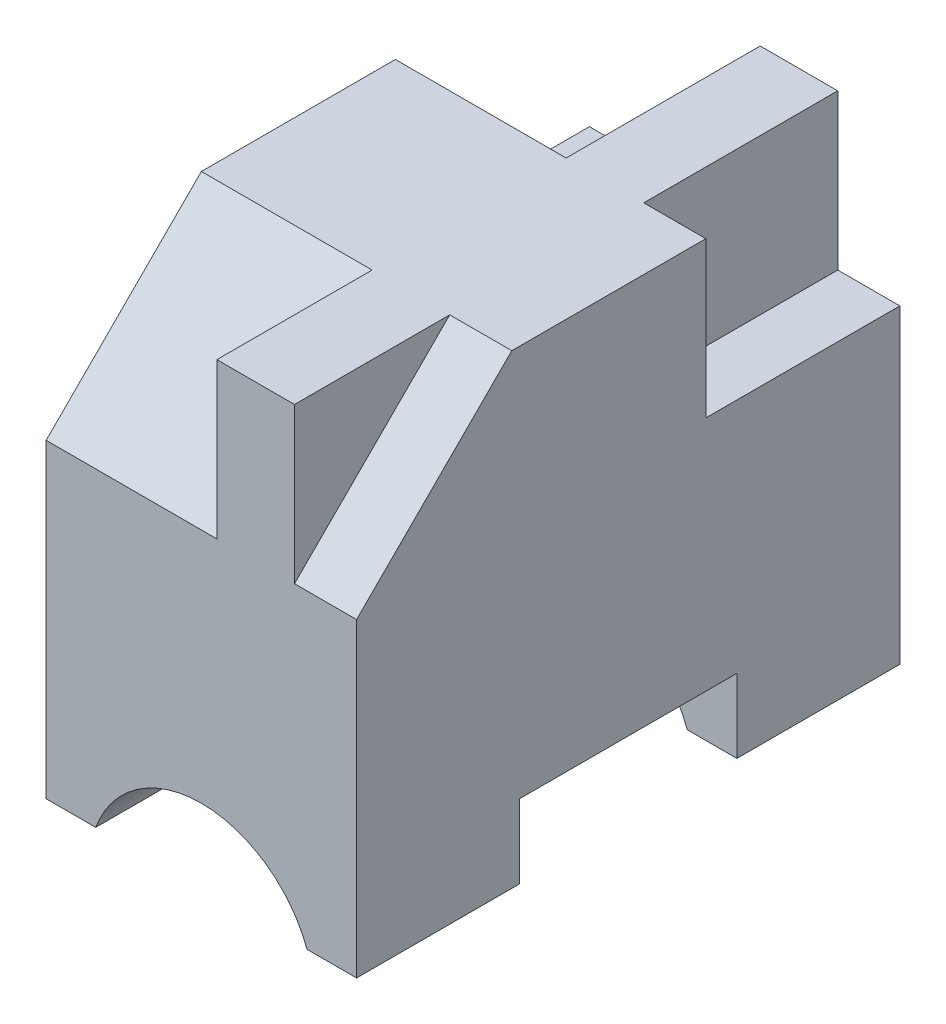
ISO-10303-21;
HEADER;
FILE_DESCRIPTION(('STEP AP214'),'2;1');
FILE_NAME('part.step','',(''),(''),'','','');
FILE_SCHEMA(('AUTOMOTIVE_DESIGN { 1 0 10303 214 1 1 1 1 }'));
ENDSEC;
DATA;
#1=APPLICATION_CONTEXT('core data for automotive mechanical design processes');
#2=APPLICATION_PROTOCOL_DEFINITION('international standard','automotive_design',2000,#1);
#3=PRODUCT_CONTEXT('',#1,'mechanical');
#4=PRODUCT('Part','Part','',(#3));
#5=PRODUCT_RELATED_PRODUCT_CATEGORY('part','',(#4));
#6=PRODUCT_DEFINITION_FORMATION('','',#4);
#7=PRODUCT_DEFINITION_CONTEXT('part definition',#1,'design');
#8=PRODUCT_DEFINITION('design','',#6,#7);
#9=PRODUCT_DEFINITION_SHAPE('','',#8);
#10=(LENGTH_UNIT() NAMED_UNIT(*) SI_UNIT(.MILLI.,.METRE.));
#11=(NAMED_UNIT(*) PLANE_ANGLE_UNIT() SI_UNIT($,.RADIAN.));
#12=(NAMED_UNIT(*) SI_UNIT($,.STERADIAN.) SOLID_ANGLE_UNIT());
#13=UNCERTAINTY_MEASURE_WITH_UNIT(LENGTH_MEASURE(1.E-05),#10,'distance_accuracy_value','');
#14=(GEOMETRIC_REPRESENTATION_CONTEXT(3) GLOBAL_UNCERTAINTY_ASSIGNED_CONTEXT((#13)) GLOBAL_UNIT_ASSIGNED_CONTEXT((#10,
#11,#12)) REPRESENTATION_CONTEXT('',''));
#15=CARTESIAN_POINT('',(0.,0.,0.));
#16=DIRECTION('',(0.,0.,1.));
#17=DIRECTION('',(1.,0.,0.));
#18=AXIS2_PLACEMENT_3D('',#15,#16,#17);
#19=CARTESIAN_POINT('',(0.,-35.,70.));
#20=DIRECTION('',(0.,0.,-1.));
#21=DIRECTION('',(-1.,0.,0.));
#22=AXIS2_PLACEMENT_3D('',#19,#20,#21);
#23=CYLINDRICAL_SURFACE('',#22,14.5);
#24=CARTESIAN_POINT('',(0.,-35.,21.));
#25=DIRECTION('',(0.,0.,-1.));
#26=DIRECTION('',(-1.,0.,0.));
#27=AXIS2_PLACEMENT_3D('',#24,#25,#26);
#28=CIRCLE('',#27,14.5);
#29=CARTESIAN_POINT('',(-13.6106575888162,-30.,21.));
#30=VERTEX_POINT('',#29);
#31=CARTESIAN_POINT('',(0.,-20.5,21.));
#32=VERTEX_POINT('',#31);
#33=EDGE_CURVE('E294',#30,#32,#28,.T.);
#34=ORIENTED_EDGE('',*,*,#33,.F.);
#35=DIRECTION('',(0.,0.,-1.));
#36=VECTOR('',#35,1.);
#37=CARTESIAN_POINT('',(-13.6106575888162,-30.,70.));
#38=LINE('',#37,#36);
#39=CARTESIAN_POINT('',(-13.6106575888162,-30.,0.));
#40=VERTEX_POINT('',#39);
#41=EDGE_CURVE('E250',#30,#40,#38,.T.);
#42=ORIENTED_EDGE('',*,*,#41,.T.);
#43=CARTESIAN_POINT('',(0.,-35.,0.));
#44=DIRECTION('',(0.,0.,1.));
#45=DIRECTION('',(1.,0.,0.));
#46=AXIS2_PLACEMENT_3D('',#43,#44,#45);
#47=CIRCLE('',#46,14.5);
#48=CARTESIAN_POINT('',(13.6106575888162,-30.,0.));
#49=VERTEX_POINT('',#48);
#50=EDGE_CURVE('E277',#49,#40,#47,.T.);
#51=ORIENTED_EDGE('',*,*,#50,.F.);
#52=DIRECTION('',(0.,0.,-1.));
#53=VECTOR('',#52,1.);
#54=CARTESIAN_POINT('',(13.6106575888162,-30.,70.));
#55=LINE('',#54,#53);
#56=CARTESIAN_POINT('',(13.6106575888162,-30.,21.));
#57=VERTEX_POINT('',#56);
#58=EDGE_CURVE('E240',#57,#49,#55,.T.);
#59=ORIENTED_EDGE('',*,*,#58,.F.);
#60=EDGE_CURVE('E295',#32,#57,#28,.T.);
#61=ORIENTED_EDGE('',*,*,#60,.F.);
#62=EDGE_LOOP('',(#34,#42,#51,#59,#61));
#63=FACE_BOUND('',#62,.T.);
#64=ADVANCED_FACE('F47',(#63),#23,.F.);
#65=CARTESIAN_POINT('',(0.,-30.,70.));
#66=DIRECTION('',(0.,1.,0.));
#67=DIRECTION('',(0.,0.,1.));
#68=AXIS2_PLACEMENT_3D('',#65,#66,#67);
#69=PLANE('',#68);
#70=CARTESIAN_POINT('',(13.6106575888162,-30.,70.));
#71=VERTEX_POINT('',#70);
#72=CARTESIAN_POINT('',(13.6106575888162,-30.,49.));
#73=VERTEX_POINT('',#72);
#74=EDGE_CURVE('E241',#71,#73,#55,.T.);
#75=ORIENTED_EDGE('',*,*,#74,.T.);
#76=DIRECTION('',(-1.,0.,0.));
#77=VECTOR('',#76,1.);
#78=CARTESIAN_POINT('',(20.,-30.,49.));
#79=LINE('',#78,#77);
#80=CARTESIAN_POINT('',(20.,-30.,49.));
#81=VERTEX_POINT('',#80);
#82=EDGE_CURVE('E297',#81,#73,#79,.T.);
#83=ORIENTED_EDGE('',*,*,#82,.F.);
#84=DIRECTION('',(0.,0.,-1.));
#85=VECTOR('',#84,1.);
#86=CARTESIAN_POINT('',(20.,-30.,70.));
#87=LINE('',#86,#85);
#88=CARTESIAN_POINT('',(20.,-30.,70.));
#89=VERTEX_POINT('',#88);
#90=EDGE_CURVE('E237',#89,#81,#87,.T.);
#91=ORIENTED_EDGE('',*,*,#90,.F.);
#92=DIRECTION('',(1.,0.,0.));
#93=VECTOR('',#92,1.);
#94=CARTESIAN_POINT('',(0.,-30.,70.));
#95=LINE('',#94,#93);
#96=EDGE_CURVE('E288',#71,#89,#95,.T.);
#97=ORIENTED_EDGE('',*,*,#96,.F.);
#98=EDGE_LOOP('',(#75,#83,#91,#97));
#99=FACE_BOUND('',#98,.T.);
#100=ADVANCED_FACE('F460',(#99),#69,.F.);
#101=DIRECTION('',(0.,0.,-1.));
#102=VECTOR('',#101,1.);
#103=CARTESIAN_POINT('',(-20.,-30.,70.));
#104=LINE('',#103,#102);
#105=CARTESIAN_POINT('',(-20.,-30.,70.));
#106=VERTEX_POINT('',#105);
#107=CARTESIAN_POINT('',(-20.,-30.,49.));
#108=VERTEX_POINT('',#107);
#109=EDGE_CURVE('E227',#106,#108,#104,.T.);
#110=ORIENTED_EDGE('',*,*,#109,.T.);
#111=DIRECTION('',(1.,0.,0.));
#112=VECTOR('',#111,1.);
#113=CARTESIAN_POINT('',(0.,-30.,49.));
#114=LINE('',#113,#112);
#115=CARTESIAN_POINT('',(-13.6106575888162,-30.,49.));
#116=VERTEX_POINT('',#115);
#117=EDGE_CURVE('E13',#108,#116,#114,.T.);
#118=ORIENTED_EDGE('',*,*,#117,.T.);
#119=CARTESIAN_POINT('',(-13.6106575888162,-30.,70.));
#120=VERTEX_POINT('',#119);
#121=EDGE_CURVE('E259',#120,#116,#38,.T.);
#122=ORIENTED_EDGE('',*,*,#121,.F.);
#123=EDGE_CURVE('E265',#106,#120,#95,.T.);
#124=ORIENTED_EDGE('',*,*,#123,.F.);
#125=EDGE_LOOP('',(#110,#118,#122,#124));
#126=FACE_BOUND('',#125,.T.);
#127=ADVANCED_FACE('F414',(#126),#69,.F.);
#128=CARTESIAN_POINT('',(0.,-35.,49.));
#129=DIRECTION('',(0.,0.,1.));
#130=DIRECTION('',(0.,-1.,0.));
#131=AXIS2_PLACEMENT_3D('',#128,#129,#130);
#132=CIRCLE('',#131,14.5);
#133=CARTESIAN_POINT('',(0.,-20.5,49.));
#134=VERTEX_POINT('',#133);
#135=EDGE_CURVE('E280',#73,#134,#132,.T.);
#136=ORIENTED_EDGE('',*,*,#135,.F.);
#137=ORIENTED_EDGE('',*,*,#74,.F.);
#138=CARTESIAN_POINT('',(0.,-35.,70.));
#139=DIRECTION('',(0.,0.,1.));
#140=DIRECTION('',(1.,0.,0.));
#141=AXIS2_PLACEMENT_3D('',#138,#139,#140);
#142=CIRCLE('',#141,14.5);
#143=EDGE_CURVE('E290',#71,#120,#142,.T.);
#144=ORIENTED_EDGE('',*,*,#143,.T.);
#145=ORIENTED_EDGE('',*,*,#121,.T.);
#146=EDGE_CURVE('E292',#134,#116,#132,.T.);
#147=ORIENTED_EDGE('',*,*,#146,.F.);
#148=EDGE_LOOP('',(#136,#137,#144,#145,#147));
#149=FACE_BOUND('',#148,.T.);
#150=ADVANCED_FACE('F49',(#149),#23,.F.);
#151=CARTESIAN_POINT('',(20.,-30.,21.));
#152=VERTEX_POINT('',#151);
#153=CARTESIAN_POINT('',(20.,-30.,0.));
#154=VERTEX_POINT('',#153);
#155=EDGE_CURVE('E230',#152,#154,#87,.T.);
#156=ORIENTED_EDGE('',*,*,#155,.F.);
#157=DIRECTION('',(-1.,0.,0.));
#158=VECTOR('',#157,1.);
#159=CARTESIAN_POINT('',(20.,-30.,21.));
#160=LINE('',#159,#158);
#161=EDGE_CURVE('E306',#152,#57,#160,.T.);
#162=ORIENTED_EDGE('',*,*,#161,.T.);
#163=ORIENTED_EDGE('',*,*,#58,.T.);
#164=DIRECTION('',(1.,0.,0.));
#165=VECTOR('',#164,1.);
#166=CARTESIAN_POINT('',(0.,-30.,0.));
#167=LINE('',#166,#165);
#168=EDGE_CURVE('E274',#49,#154,#167,.T.);
#169=ORIENTED_EDGE('',*,*,#168,.T.);
#170=EDGE_LOOP('',(#156,#162,#163,#169));
#171=FACE_BOUND('',#170,.T.);
#172=ADVANCED_FACE('F467',(#171),#69,.F.);
#173=CARTESIAN_POINT('',(20.,0.,70.));
#174=DIRECTION('',(-1.,0.,0.));
#175=DIRECTION('',(0.,0.,1.));
#176=AXIS2_PLACEMENT_3D('',#173,#174,#175);
#177=PLANE('',#176);
#178=DIRECTION('',(0.,1.,0.));
#179=VECTOR('',#178,1.);
#180=CARTESIAN_POINT('',(20.,0.,0.));
#181=LINE('',#180,#179);
#182=CARTESIAN_POINT('',(20.,10.,0.));
#183=VERTEX_POINT('',#182);
#184=EDGE_CURVE('E271',#154,#183,#181,.T.);
#185=ORIENTED_EDGE('',*,*,#184,.T.);
#186=DIRECTION('',(0.,0.,-1.));
#187=VECTOR('',#186,1.);
#188=CARTESIAN_POINT('',(20.,10.,0.));
#189=LINE('',#188,#187);
#190=CARTESIAN_POINT('',(20.,10.,25.));
#191=VERTEX_POINT('',#190);
#192=EDGE_CURVE('E349',#191,#183,#189,.T.);
#193=ORIENTED_EDGE('',*,*,#192,.F.);
#194=DIRECTION('',(0.,-1.,0.));
#195=VECTOR('',#194,1.);
#196=CARTESIAN_POINT('',(20.,30.,25.));
#197=LINE('',#196,#195);
#198=CARTESIAN_POINT('',(20.,30.,25.));
#199=VERTEX_POINT('',#198);
#200=EDGE_CURVE('E352',#199,#191,#197,.T.);
#201=ORIENTED_EDGE('',*,*,#200,.F.);
#202=DIRECTION('',(0.,0.,-1.));
#203=VECTOR('',#202,1.);
#204=CARTESIAN_POINT('',(20.,30.,70.));
#205=LINE('',#204,#203);
#206=CARTESIAN_POINT('',(20.,30.,50.));
#207=VERTEX_POINT('',#206);
#208=EDGE_CURVE('E226',#207,#199,#205,.T.);
#209=ORIENTED_EDGE('',*,*,#208,.F.);
#210=DIRECTION('',(0.,0.707106781186547,-0.707106781186548));
#211=VECTOR('',#210,1.);
#212=CARTESIAN_POINT('',(20.,10.,70.));
#213=LINE('',#212,#211);
#214=CARTESIAN_POINT('',(20.,10.,70.));
#215=VERTEX_POINT('',#214);
#216=EDGE_CURVE('E332',#215,#207,#213,.T.);
#217=ORIENTED_EDGE('',*,*,#216,.F.);
#218=DIRECTION('',(0.,1.,0.));
#219=VECTOR('',#218,1.);
#220=CARTESIAN_POINT('',(20.,0.,70.));
#221=LINE('',#220,#219);
#222=EDGE_CURVE('E285',#89,#215,#221,.T.);
#223=ORIENTED_EDGE('',*,*,#222,.F.);
#224=ORIENTED_EDGE('',*,*,#90,.T.);
#225=DIRECTION('',(0.,1.,0.));
#226=VECTOR('',#225,1.);
#227=CARTESIAN_POINT('',(20.,-30.,49.));
#228=LINE('',#227,#226);
#229=CARTESIAN_POINT('',(20.,-20.5,49.));
#230=VERTEX_POINT('',#229);
#231=EDGE_CURVE('E311',#81,#230,#228,.T.);
#232=ORIENTED_EDGE('',*,*,#231,.T.);
#233=DIRECTION('',(0.,0.,-1.));
#234=VECTOR('',#233,1.);
#235=CARTESIAN_POINT('',(20.,-20.5,21.));
#236=LINE('',#235,#234);
#237=CARTESIAN_POINT('',(20.,-20.5,21.));
#238=VERTEX_POINT('',#237);
#239=EDGE_CURVE('E322',#230,#238,#236,.T.);
#240=ORIENTED_EDGE('',*,*,#239,.T.);
#241=DIRECTION('',(0.,-1.,0.));
#242=VECTOR('',#241,1.);
#243=CARTESIAN_POINT('',(20.,-30.,21.));
#244=LINE('',#243,#242);
#245=EDGE_CURVE('E319',#238,#152,#244,.T.);
#246=ORIENTED_EDGE('',*,*,#245,.T.);
#247=ORIENTED_EDGE('',*,*,#155,.T.);
#248=EDGE_LOOP('',(#185,#193,#201,#209,#217,#223,#224,#232,#240,#246,#247));
#249=FACE_BOUND('',#248,.T.);
#250=ADVANCED_FACE('F406',(#249),#177,.F.);
#251=CARTESIAN_POINT('',(0.,30.,70.));
#252=DIRECTION('',(0.,1.,0.));
#253=DIRECTION('',(0.,0.,1.));
#254=AXIS2_PLACEMENT_3D('',#251,#252,#253);
#255=PLANE('',#254);
#256=DIRECTION('',(1.,0.,0.));
#257=VECTOR('',#256,1.);
#258=CARTESIAN_POINT('',(-20.,30.,25.));
#259=LINE('',#258,#257);
#260=CARTESIAN_POINT('',(-20.,30.,25.));
#261=VERTEX_POINT('',#260);
#262=CARTESIAN_POINT('',(1.99999999999999,30.,25.));
#263=VERTEX_POINT('',#262);
#264=EDGE_CURVE('E206',#261,#263,#259,.T.);
#265=ORIENTED_EDGE('',*,*,#264,.F.);
#266=DIRECTION('',(0.,0.,-1.));
#267=VECTOR('',#266,1.);
#268=CARTESIAN_POINT('',(-20.,30.,70.));
#269=LINE('',#268,#267);
#270=CARTESIAN_POINT('',(-20.,30.,50.));
#271=VERTEX_POINT('',#270);
#272=EDGE_CURVE('E219',#271,#261,#269,.T.);
#273=ORIENTED_EDGE('',*,*,#272,.F.);
#274=DIRECTION('',(1.,0.,0.));
#275=VECTOR('',#274,1.);
#276=CARTESIAN_POINT('',(-20.,30.,50.));
#277=LINE('',#276,#275);
#278=CARTESIAN_POINT('',(1.99999999999999,30.,50.));
#279=VERTEX_POINT('',#278);
#280=EDGE_CURVE('E355',#271,#279,#277,.T.);
#281=ORIENTED_EDGE('',*,*,#280,.T.);
#282=DIRECTION('',(0.,0.,1.));
#283=VECTOR('',#282,1.);
#284=CARTESIAN_POINT('',(1.99999999999999,30.,50.));
#285=LINE('',#284,#283);
#286=CARTESIAN_POINT('',(1.99999999999999,30.,70.));
#287=VERTEX_POINT('',#286);
#288=EDGE_CURVE('E372',#279,#287,#285,.T.);
#289=ORIENTED_EDGE('',*,*,#288,.T.);
#290=DIRECTION('',(1.,0.,0.));
#291=VECTOR('',#290,1.);
#292=CARTESIAN_POINT('',(0.,30.,70.));
#293=LINE('',#292,#291);
#294=CARTESIAN_POINT('',(12.,30.,70.));
#295=VERTEX_POINT('',#294);
#296=EDGE_CURVE('E283',#287,#295,#293,.T.);
#297=ORIENTED_EDGE('',*,*,#296,.T.);
#298=DIRECTION('',(0.,0.,1.));
#299=VECTOR('',#298,1.);
#300=CARTESIAN_POINT('',(12.,30.,50.));
#301=LINE('',#300,#299);
#302=CARTESIAN_POINT('',(12.,30.,50.));
#303=VERTEX_POINT('',#302);
#304=EDGE_CURVE('E334',#303,#295,#301,.T.);
#305=ORIENTED_EDGE('',*,*,#304,.F.);
#306=DIRECTION('',(1.,0.,0.));
#307=VECTOR('',#306,1.);
#308=CARTESIAN_POINT('',(12.,30.,50.));
#309=LINE('',#308,#307);
#310=EDGE_CURVE('E318',#303,#207,#309,.T.);
#311=ORIENTED_EDGE('',*,*,#310,.T.);
#312=ORIENTED_EDGE('',*,*,#208,.T.);
#313=DIRECTION('',(1.,0.,0.));
#314=VECTOR('',#313,1.);
#315=CARTESIAN_POINT('',(12.,30.,25.));
#316=LINE('',#315,#314);
#317=CARTESIAN_POINT('',(12.,30.,25.));
#318=VERTEX_POINT('',#317);
#319=EDGE_CURVE('E342',#318,#199,#316,.T.);
#320=ORIENTED_EDGE('',*,*,#319,.F.);
#321=DIRECTION('',(0.,0.,1.));
#322=VECTOR('',#321,1.);
#323=CARTESIAN_POINT('',(12.,30.,0.));
#324=LINE('',#323,#322);
#325=CARTESIAN_POINT('',(12.,30.,0.));
#326=VERTEX_POINT('',#325);
#327=EDGE_CURVE('E360',#326,#318,#324,.T.);
#328=ORIENTED_EDGE('',*,*,#327,.F.);
#329=DIRECTION('',(1.,0.,0.));
#330=VECTOR('',#329,1.);
#331=CARTESIAN_POINT('',(0.,30.,0.));
#332=LINE('',#331,#330);
#333=CARTESIAN_POINT('',(1.99999999999999,30.,0.));
#334=VERTEX_POINT('',#333);
#335=EDGE_CURVE('E269',#334,#326,#332,.T.);
#336=ORIENTED_EDGE('',*,*,#335,.F.);
#337=DIRECTION('',(0.,0.,1.));
#338=VECTOR('',#337,1.);
#339=CARTESIAN_POINT('',(1.99999999999999,30.,0.));
#340=LINE('',#339,#338);
#341=EDGE_CURVE('E62',#334,#263,#340,.T.);
#342=ORIENTED_EDGE('',*,*,#341,.T.);
#343=EDGE_LOOP('',(#265,#273,#281,#289,#297,#305,#311,#312,#320,#328,#336,#342));
#344=FACE_BOUND('',#343,.T.);
#345=ADVANCED_FACE('F217',(#344),#255,.T.);
#346=CARTESIAN_POINT('',(-20.,0.,70.));
#347=DIRECTION('',(-1.,0.,0.));
#348=DIRECTION('',(0.,0.,1.));
#349=AXIS2_PLACEMENT_3D('',#346,#347,#348);
#350=PLANE('',#349);
#351=DIRECTION('',(0.,0.,-1.));
#352=VECTOR('',#351,1.);
#353=CARTESIAN_POINT('',(-20.,10.,0.));
#354=LINE('',#353,#352);
#355=CARTESIAN_POINT('',(-20.,10.,25.));
#356=VERTEX_POINT('',#355);
#357=CARTESIAN_POINT('',(-20.,10.,0.));
#358=VERTEX_POINT('',#357);
#359=EDGE_CURVE('E212',#356,#358,#354,.T.);
#360=ORIENTED_EDGE('',*,*,#359,.T.);
#361=DIRECTION('',(0.,1.,0.));
#362=VECTOR('',#361,1.);
#363=CARTESIAN_POINT('',(-20.,0.,0.));
#364=LINE('',#363,#362);
#365=CARTESIAN_POINT('',(-20.,-30.,0.));
#366=VERTEX_POINT('',#365);
#367=EDGE_CURVE('E258',#366,#358,#364,.T.);
#368=ORIENTED_EDGE('',*,*,#367,.F.);
#369=CARTESIAN_POINT('',(-20.,-30.,21.));
#370=VERTEX_POINT('',#369);
#371=EDGE_CURVE('E233',#370,#366,#104,.T.);
#372=ORIENTED_EDGE('',*,*,#371,.F.);
#373=DIRECTION('',(0.,-1.,0.));
#374=VECTOR('',#373,1.);
#375=CARTESIAN_POINT('',(-20.,-30.,21.));
#376=LINE('',#375,#374);
#377=CARTESIAN_POINT('',(-20.,-20.5,21.));
#378=VERTEX_POINT('',#377);
#379=EDGE_CURVE('E256',#378,#370,#376,.T.);
#380=ORIENTED_EDGE('',*,*,#379,.F.);
#381=DIRECTION('',(0.,0.,-1.));
#382=VECTOR('',#381,1.);
#383=CARTESIAN_POINT('',(-20.,-20.5,21.));
#384=LINE('',#383,#382);
#385=CARTESIAN_POINT('',(-20.,-20.5,49.));
#386=VERTEX_POINT('',#385);
#387=EDGE_CURVE('E312',#386,#378,#384,.T.);
#388=ORIENTED_EDGE('',*,*,#387,.F.);
#389=DIRECTION('',(0.,1.,0.));
#390=VECTOR('',#389,1.);
#391=CARTESIAN_POINT('',(-20.,-30.,49.));
#392=LINE('',#391,#390);
#393=EDGE_CURVE('E315',#108,#386,#392,.T.);
#394=ORIENTED_EDGE('',*,*,#393,.F.);
#395=ORIENTED_EDGE('',*,*,#109,.F.);
#396=DIRECTION('',(0.,1.,0.));
#397=VECTOR('',#396,1.);
#398=CARTESIAN_POINT('',(-20.,0.,70.));
#399=LINE('',#398,#397);
#400=CARTESIAN_POINT('',(-20.,10.,70.));
#401=VERTEX_POINT('',#400);
#402=EDGE_CURVE('E281',#106,#401,#399,.T.);
#403=ORIENTED_EDGE('',*,*,#402,.T.);
#404=DIRECTION('',(0.,0.707106781186547,-0.707106781186548));
#405=VECTOR('',#404,1.);
#406=CARTESIAN_POINT('',(-20.,10.,70.));
#407=LINE('',#406,#405);
#408=EDGE_CURVE('E225',#401,#271,#407,.T.);
#409=ORIENTED_EDGE('',*,*,#408,.T.);
#410=ORIENTED_EDGE('',*,*,#272,.T.);
#411=DIRECTION('',(0.,-1.,0.));
#412=VECTOR('',#411,1.);
#413=CARTESIAN_POINT('',(-20.,30.,25.));
#414=LINE('',#413,#412);
#415=EDGE_CURVE('E202',#261,#356,#414,.T.);
#416=ORIENTED_EDGE('',*,*,#415,.T.);
#417=EDGE_LOOP('',(#360,#368,#372,#380,#388,#394,#395,#403,#409,#410,#416));
#418=FACE_BOUND('',#417,.T.);
#419=ADVANCED_FACE('F223',(#418),#350,.T.);
#420=ORIENTED_EDGE('',*,*,#41,.F.);
#421=DIRECTION('',(-1.,0.,0.));
#422=VECTOR('',#421,1.);
#423=CARTESIAN_POINT('',(0.,-30.,21.));
#424=LINE('',#423,#422);
#425=EDGE_CURVE('E55',#30,#370,#424,.T.);
#426=ORIENTED_EDGE('',*,*,#425,.T.);
#427=ORIENTED_EDGE('',*,*,#371,.T.);
#428=EDGE_CURVE('E268',#366,#40,#167,.T.);
#429=ORIENTED_EDGE('',*,*,#428,.T.);
#430=EDGE_LOOP('',(#420,#426,#427,#429));
#431=FACE_BOUND('',#430,.T.);
#432=ADVANCED_FACE('F247',(#431),#69,.F.);
#433=CARTESIAN_POINT('',(0.,0.,70.));
#434=DIRECTION('',(0.,0.,1.));
#435=DIRECTION('',(1.,0.,0.));
#436=AXIS2_PLACEMENT_3D('',#433,#434,#435);
#437=PLANE('',#436);
#438=DIRECTION('',(1.,0.,0.));
#439=VECTOR('',#438,1.);
#440=CARTESIAN_POINT('',(-20.,10.,70.));
#441=LINE('',#440,#439);
#442=CARTESIAN_POINT('',(1.99999999999999,10.,70.));
#443=VERTEX_POINT('',#442);
#444=EDGE_CURVE('E365',#401,#443,#441,.T.);
#445=ORIENTED_EDGE('',*,*,#444,.F.);
#446=ORIENTED_EDGE('',*,*,#402,.F.);
#447=ORIENTED_EDGE('',*,*,#123,.T.);
#448=ORIENTED_EDGE('',*,*,#143,.F.);
#449=ORIENTED_EDGE('',*,*,#96,.T.);
#450=ORIENTED_EDGE('',*,*,#222,.T.);
#451=DIRECTION('',(1.,0.,0.));
#452=VECTOR('',#451,1.);
#453=CARTESIAN_POINT('',(12.,10.,70.));
#454=LINE('',#453,#452);
#455=CARTESIAN_POINT('',(12.,10.,70.));
#456=VERTEX_POINT('',#455);
#457=EDGE_CURVE('E327',#456,#215,#454,.T.);
#458=ORIENTED_EDGE('',*,*,#457,.F.);
#459=DIRECTION('',(0.,-1.,0.));
#460=VECTOR('',#459,1.);
#461=CARTESIAN_POINT('',(12.,30.,70.));
#462=LINE('',#461,#460);
#463=EDGE_CURVE('E338',#295,#456,#462,.T.);
#464=ORIENTED_EDGE('',*,*,#463,.F.);
#465=ORIENTED_EDGE('',*,*,#296,.F.);
#466=DIRECTION('',(0.,-1.,0.));
#467=VECTOR('',#466,1.);
#468=CARTESIAN_POINT('',(1.99999999999999,30.,70.));
#469=LINE('',#468,#467);
#470=EDGE_CURVE('E369',#287,#443,#469,.T.);
#471=ORIENTED_EDGE('',*,*,#470,.T.);
#472=EDGE_LOOP('',(#445,#446,#447,#448,#449,#450,#458,#464,#465,#471));
#473=FACE_BOUND('',#472,.T.);
#474=ADVANCED_FACE('F419',(#473),#437,.T.);
#475=CARTESIAN_POINT('',(0.,0.,0.));
#476=DIRECTION('',(0.,0.,1.));
#477=DIRECTION('',(1.,0.,0.));
#478=AXIS2_PLACEMENT_3D('',#475,#476,#477);
#479=PLANE('',#478);
#480=ORIENTED_EDGE('',*,*,#367,.T.);
#481=DIRECTION('',(1.,0.,0.));
#482=VECTOR('',#481,1.);
#483=CARTESIAN_POINT('',(-20.,10.,0.));
#484=LINE('',#483,#482);
#485=CARTESIAN_POINT('',(1.99999999999999,10.,0.));
#486=VERTEX_POINT('',#485);
#487=EDGE_CURVE('E375',#358,#486,#484,.T.);
#488=ORIENTED_EDGE('',*,*,#487,.T.);
#489=DIRECTION('',(0.,1.,0.));
#490=VECTOR('',#489,1.);
#491=CARTESIAN_POINT('',(1.99999999999999,30.,0.));
#492=LINE('',#491,#490);
#493=EDGE_CURVE('E385',#486,#334,#492,.T.);
#494=ORIENTED_EDGE('',*,*,#493,.T.);
#495=ORIENTED_EDGE('',*,*,#335,.T.);
#496=DIRECTION('',(0.,1.,0.));
#497=VECTOR('',#496,1.);
#498=CARTESIAN_POINT('',(12.,30.,0.));
#499=LINE('',#498,#497);
#500=CARTESIAN_POINT('',(12.,10.,0.));
#501=VERTEX_POINT('',#500);
#502=EDGE_CURVE('E351',#501,#326,#499,.T.);
#503=ORIENTED_EDGE('',*,*,#502,.F.);
#504=DIRECTION('',(1.,0.,0.));
#505=VECTOR('',#504,1.);
#506=CARTESIAN_POINT('',(12.,10.,0.));
#507=LINE('',#506,#505);
#508=EDGE_CURVE('E335',#501,#183,#507,.T.);
#509=ORIENTED_EDGE('',*,*,#508,.T.);
#510=ORIENTED_EDGE('',*,*,#184,.F.);
#511=ORIENTED_EDGE('',*,*,#168,.F.);
#512=ORIENTED_EDGE('',*,*,#50,.T.);
#513=ORIENTED_EDGE('',*,*,#428,.F.);
#514=EDGE_LOOP('',(#480,#488,#494,#495,#503,#509,#510,#511,#512,#513));
#515=FACE_BOUND('',#514,.T.);
#516=ADVANCED_FACE('F389',(#515),#479,.F.);
#517=CARTESIAN_POINT('',(20.,-20.5,21.));
#518=DIRECTION('',(0.,1.,0.));
#519=DIRECTION('',(0.,0.,1.));
#520=AXIS2_PLACEMENT_3D('',#517,#518,#519);
#521=PLANE('',#520);
#522=DIRECTION('',(-1.,0.,0.));
#523=VECTOR('',#522,1.);
#524=CARTESIAN_POINT('',(20.,-20.5,49.));
#525=LINE('',#524,#523);
#526=EDGE_CURVE('E302',#134,#386,#525,.T.);
#527=ORIENTED_EDGE('',*,*,#526,.T.);
#528=ORIENTED_EDGE('',*,*,#387,.T.);
#529=DIRECTION('',(-1.,0.,0.));
#530=VECTOR('',#529,1.);
#531=CARTESIAN_POINT('',(20.,-20.5,21.));
#532=LINE('',#531,#530);
#533=EDGE_CURVE('E301',#32,#378,#532,.T.);
#534=ORIENTED_EDGE('',*,*,#533,.F.);
#535=EDGE_CURVE('E303',#238,#32,#532,.T.);
#536=ORIENTED_EDGE('',*,*,#535,.F.);
#537=ORIENTED_EDGE('',*,*,#239,.F.);
#538=EDGE_CURVE('E298',#230,#134,#525,.T.);
#539=ORIENTED_EDGE('',*,*,#538,.T.);
#540=EDGE_LOOP('',(#527,#528,#534,#536,#537,#539));
#541=FACE_BOUND('',#540,.T.);
#542=ADVANCED_FACE('F399',(#541),#521,.F.);
#543=CARTESIAN_POINT('',(20.,-30.,49.));
#544=DIRECTION('',(0.,0.,1.));
#545=DIRECTION('',(0.,-1.,0.));
#546=AXIS2_PLACEMENT_3D('',#543,#544,#545);
#547=PLANE('',#546);
#548=ORIENTED_EDGE('',*,*,#135,.T.);
#549=ORIENTED_EDGE('',*,*,#538,.F.);
#550=ORIENTED_EDGE('',*,*,#231,.F.);
#551=ORIENTED_EDGE('',*,*,#82,.T.);
#552=EDGE_LOOP('',(#548,#549,#550,#551));
#553=FACE_BOUND('',#552,.T.);
#554=ADVANCED_FACE('F519',(#553),#547,.F.);
#555=CARTESIAN_POINT('',(20.,-30.,21.));
#556=DIRECTION('',(0.,0.,-1.));
#557=DIRECTION('',(-1.,0.,0.));
#558=AXIS2_PLACEMENT_3D('',#555,#556,#557);
#559=PLANE('',#558);
#560=ORIENTED_EDGE('',*,*,#33,.T.);
#561=ORIENTED_EDGE('',*,*,#533,.T.);
#562=ORIENTED_EDGE('',*,*,#379,.T.);
#563=ORIENTED_EDGE('',*,*,#425,.F.);
#564=EDGE_LOOP('',(#560,#561,#562,#563));
#565=FACE_BOUND('',#564,.T.);
#566=ADVANCED_FACE('F397',(#565),#559,.F.);
#567=ORIENTED_EDGE('',*,*,#146,.T.);
#568=ORIENTED_EDGE('',*,*,#117,.F.);
#569=ORIENTED_EDGE('',*,*,#393,.T.);
#570=ORIENTED_EDGE('',*,*,#526,.F.);
#571=EDGE_LOOP('',(#567,#568,#569,#570));
#572=FACE_BOUND('',#571,.T.);
#573=ADVANCED_FACE('F411',(#572),#547,.F.);
#574=ORIENTED_EDGE('',*,*,#60,.T.);
#575=ORIENTED_EDGE('',*,*,#161,.F.);
#576=ORIENTED_EDGE('',*,*,#245,.F.);
#577=ORIENTED_EDGE('',*,*,#535,.T.);
#578=EDGE_LOOP('',(#574,#575,#576,#577));
#579=FACE_BOUND('',#578,.T.);
#580=ADVANCED_FACE('F403',(#579),#559,.F.);
#581=CARTESIAN_POINT('',(12.,10.,70.));
#582=DIRECTION('',(0.,-0.707106781186548,-0.707106781186547));
#583=DIRECTION('',(0.,0.707106781186547,-0.707106781186548));
#584=AXIS2_PLACEMENT_3D('',#581,#582,#583);
#585=PLANE('',#584);
#586=ORIENTED_EDGE('',*,*,#216,.T.);
#587=ORIENTED_EDGE('',*,*,#310,.F.);
#588=DIRECTION('',(0.,0.707106781186547,-0.707106781186548));
#589=VECTOR('',#588,1.);
#590=CARTESIAN_POINT('',(12.,10.,70.));
#591=LINE('',#590,#589);
#592=EDGE_CURVE('E329',#456,#303,#591,.T.);
#593=ORIENTED_EDGE('',*,*,#592,.F.);
#594=ORIENTED_EDGE('',*,*,#457,.T.);
#595=EDGE_LOOP('',(#586,#587,#593,#594));
#596=FACE_BOUND('',#595,.T.);
#597=ADVANCED_FACE('F431',(#596),#585,.F.);
#598=CARTESIAN_POINT('',(12.,0.,0.));
#599=DIRECTION('',(1.,0.,0.));
#600=DIRECTION('',(0.,0.,-1.));
#601=AXIS2_PLACEMENT_3D('',#598,#599,#600);
#602=PLANE('',#601);
#603=ORIENTED_EDGE('',*,*,#304,.T.);
#604=ORIENTED_EDGE('',*,*,#463,.T.);
#605=ORIENTED_EDGE('',*,*,#592,.T.);
#606=EDGE_LOOP('',(#603,#604,#605));
#607=FACE_BOUND('',#606,.T.);
#608=ADVANCED_FACE('F429',(#607),#602,.T.);
#609=CARTESIAN_POINT('',(12.,10.,0.));
#610=DIRECTION('',(0.,-1.,0.));
#611=DIRECTION('',(0.,0.,-1.));
#612=AXIS2_PLACEMENT_3D('',#609,#610,#611);
#613=PLANE('',#612);
#614=ORIENTED_EDGE('',*,*,#192,.T.);
#615=ORIENTED_EDGE('',*,*,#508,.F.);
#616=DIRECTION('',(0.,0.,-1.));
#617=VECTOR('',#616,1.);
#618=CARTESIAN_POINT('',(12.,10.,0.));
#619=LINE('',#618,#617);
#620=CARTESIAN_POINT('',(12.,10.,25.));
#621=VERTEX_POINT('',#620);
#622=EDGE_CURVE('E345',#621,#501,#619,.T.);
#623=ORIENTED_EDGE('',*,*,#622,.F.);
#624=DIRECTION('',(1.,0.,0.));
#625=VECTOR('',#624,1.);
#626=CARTESIAN_POINT('',(12.,10.,25.));
#627=LINE('',#626,#625);
#628=EDGE_CURVE('E344',#621,#191,#627,.T.);
#629=ORIENTED_EDGE('',*,*,#628,.T.);
#630=EDGE_LOOP('',(#614,#615,#623,#629));
#631=FACE_BOUND('',#630,.T.);
#632=ADVANCED_FACE('F552',(#631),#613,.F.);
#633=CARTESIAN_POINT('',(12.,30.,25.));
#634=DIRECTION('',(0.,0.,1.));
#635=DIRECTION('',(0.,-1.,0.));
#636=AXIS2_PLACEMENT_3D('',#633,#634,#635);
#637=PLANE('',#636);
#638=ORIENTED_EDGE('',*,*,#200,.T.);
#639=ORIENTED_EDGE('',*,*,#628,.F.);
#640=DIRECTION('',(0.,-1.,0.));
#641=VECTOR('',#640,1.);
#642=CARTESIAN_POINT('',(12.,30.,25.));
#643=LINE('',#642,#641);
#644=EDGE_CURVE('E357',#318,#621,#643,.T.);
#645=ORIENTED_EDGE('',*,*,#644,.F.);
#646=ORIENTED_EDGE('',*,*,#319,.T.);
#647=EDGE_LOOP('',(#638,#639,#645,#646));
#648=FACE_BOUND('',#647,.T.);
#649=ADVANCED_FACE('F439',(#648),#637,.F.);
#650=CARTESIAN_POINT('',(12.,0.,0.));
#651=DIRECTION('',(-1.,0.,0.));
#652=DIRECTION('',(0.,0.,1.));
#653=AXIS2_PLACEMENT_3D('',#650,#651,#652);
#654=PLANE('',#653);
#655=ORIENTED_EDGE('',*,*,#502,.T.);
#656=ORIENTED_EDGE('',*,*,#327,.T.);
#657=ORIENTED_EDGE('',*,*,#644,.T.);
#658=ORIENTED_EDGE('',*,*,#622,.T.);
#659=EDGE_LOOP('',(#655,#656,#657,#658));
#660=FACE_BOUND('',#659,.T.);
#661=ADVANCED_FACE('F442',(#660),#654,.F.);
#662=CARTESIAN_POINT('',(-20.,10.,70.));
#663=DIRECTION('',(0.,-0.707106781186548,-0.707106781186547));
#664=DIRECTION('',(0.,0.707106781186547,-0.707106781186548));
#665=AXIS2_PLACEMENT_3D('',#662,#663,#664);
#666=PLANE('',#665);
#667=DIRECTION('',(0.,0.707106781186547,-0.707106781186548));
#668=VECTOR('',#667,1.);
#669=CARTESIAN_POINT('',(1.99999999999999,10.,70.));
#670=LINE('',#669,#668);
#671=EDGE_CURVE('E70',#443,#279,#670,.T.);
#672=ORIENTED_EDGE('',*,*,#671,.T.);
#673=ORIENTED_EDGE('',*,*,#280,.F.);
#674=ORIENTED_EDGE('',*,*,#408,.F.);
#675=ORIENTED_EDGE('',*,*,#444,.T.);
#676=EDGE_LOOP('',(#672,#673,#674,#675));
#677=FACE_BOUND('',#676,.T.);
#678=ADVANCED_FACE('F423',(#677),#666,.F.);
#679=CARTESIAN_POINT('',(1.99999999999999,0.,0.));
#680=DIRECTION('',(1.,0.,0.));
#681=DIRECTION('',(0.,0.,-1.));
#682=AXIS2_PLACEMENT_3D('',#679,#680,#681);
#683=PLANE('',#682);
#684=ORIENTED_EDGE('',*,*,#288,.F.);
#685=ORIENTED_EDGE('',*,*,#671,.F.);
#686=ORIENTED_EDGE('',*,*,#470,.F.);
#687=EDGE_LOOP('',(#684,#685,#686));
#688=FACE_BOUND('',#687,.T.);
#689=ADVANCED_FACE('F450',(#688),#683,.F.);
#690=CARTESIAN_POINT('',(-20.,10.,0.));
#691=DIRECTION('',(0.,-1.,0.));
#692=DIRECTION('',(0.,0.,-1.));
#693=AXIS2_PLACEMENT_3D('',#690,#691,#692);
#694=PLANE('',#693);
#695=DIRECTION('',(0.,0.,-1.));
#696=VECTOR('',#695,1.);
#697=CARTESIAN_POINT('',(1.99999999999999,10.,0.));
#698=LINE('',#697,#696);
#699=CARTESIAN_POINT('',(1.99999999999999,10.,25.));
#700=VERTEX_POINT('',#699);
#701=EDGE_CURVE('E213',#700,#486,#698,.T.);
#702=ORIENTED_EDGE('',*,*,#701,.T.);
#703=ORIENTED_EDGE('',*,*,#487,.F.);
#704=ORIENTED_EDGE('',*,*,#359,.F.);
#705=DIRECTION('',(1.,0.,0.));
#706=VECTOR('',#705,1.);
#707=CARTESIAN_POINT('',(-20.,10.,25.));
#708=LINE('',#707,#706);
#709=EDGE_CURVE('E207',#356,#700,#708,.T.);
#710=ORIENTED_EDGE('',*,*,#709,.T.);
#711=EDGE_LOOP('',(#702,#703,#704,#710));
#712=FACE_BOUND('',#711,.T.);
#713=ADVANCED_FACE('F448',(#712),#694,.F.);
#714=CARTESIAN_POINT('',(-20.,30.,25.));
#715=DIRECTION('',(0.,0.,1.));
#716=DIRECTION('',(0.,-1.,0.));
#717=AXIS2_PLACEMENT_3D('',#714,#715,#716);
#718=PLANE('',#717);
#719=DIRECTION('',(0.,-1.,0.));
#720=VECTOR('',#719,1.);
#721=CARTESIAN_POINT('',(1.99999999999999,30.,25.));
#722=LINE('',#721,#720);
#723=EDGE_CURVE('E382',#263,#700,#722,.T.);
#724=ORIENTED_EDGE('',*,*,#723,.T.);
#725=ORIENTED_EDGE('',*,*,#709,.F.);
#726=ORIENTED_EDGE('',*,*,#415,.F.);
#727=ORIENTED_EDGE('',*,*,#264,.T.);
#728=EDGE_LOOP('',(#724,#725,#726,#727));
#729=FACE_BOUND('',#728,.T.);
#730=ADVANCED_FACE('F205',(#729),#718,.F.);
#731=CARTESIAN_POINT('',(1.99999999999999,0.,0.));
#732=DIRECTION('',(-1.,0.,0.));
#733=DIRECTION('',(0.,0.,1.));
#734=AXIS2_PLACEMENT_3D('',#731,#732,#733);
#735=PLANE('',#734);
#736=ORIENTED_EDGE('',*,*,#493,.F.);
#737=ORIENTED_EDGE('',*,*,#701,.F.);
#738=ORIENTED_EDGE('',*,*,#723,.F.);
#739=ORIENTED_EDGE('',*,*,#341,.F.);
#740=EDGE_LOOP('',(#736,#737,#738,#739));
#741=FACE_BOUND('',#740,.T.);
#742=ADVANCED_FACE('F447',(#741),#735,.T.);
#743=CLOSED_SHELL('',(#64,#100,#127,#150,#172,#250,#345,#419,#432,#474,#516,#542,#554,#566,#573,
#580,#597,#608,#632,#649,#661,#678,#689,#713,#730,#742));
#744=MANIFOLD_SOLID_BREP('B2',#743);
#745=ADVANCED_BREP_SHAPE_REPRESENTATION('',(#18,#744),#14);
#746=SHAPE_DEFINITION_REPRESENTATION(#9,#745);
ENDSEC;
END-ISO-10303-21;
